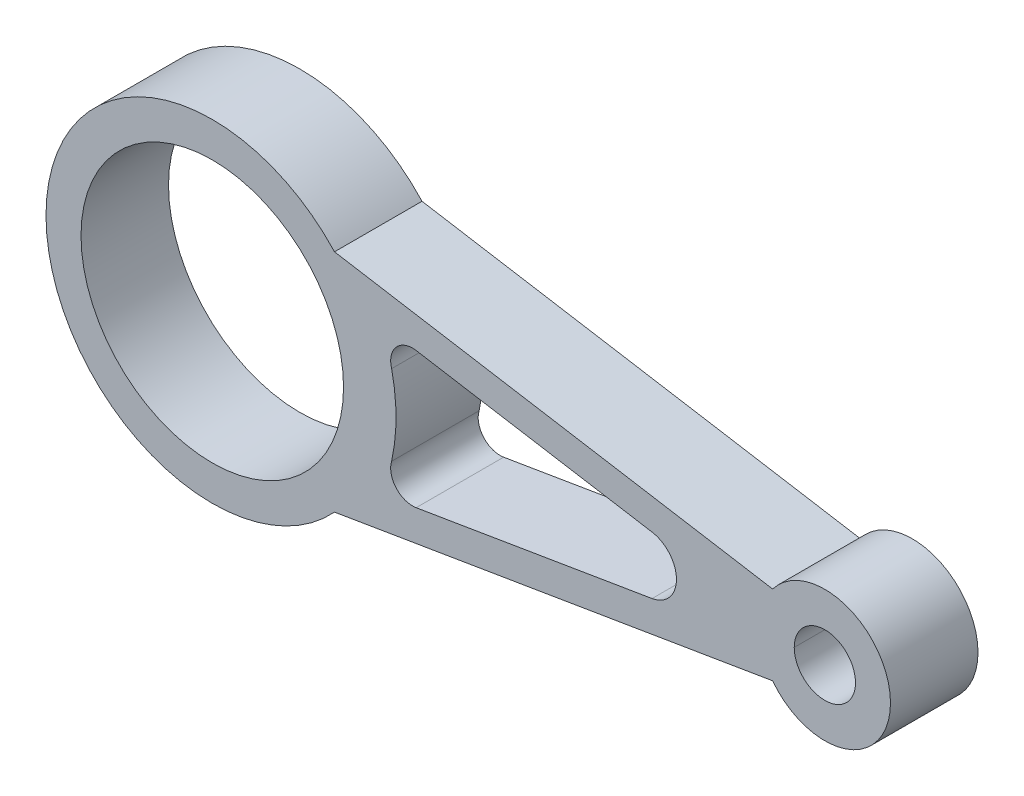
ISO-10303-21;
HEADER;
FILE_DESCRIPTION(('STEP AP214'),'2;1');
FILE_NAME('part.step','',(''),(''),'','','');
FILE_SCHEMA(('AUTOMOTIVE_DESIGN { 1 0 10303 214 1 1 1 1 }'));
ENDSEC;
DATA;
#1=APPLICATION_CONTEXT('core data for automotive mechanical design processes');
#2=APPLICATION_PROTOCOL_DEFINITION('international standard','automotive_design',2000,#1);
#3=PRODUCT_CONTEXT('',#1,'mechanical');
#4=PRODUCT('Part','Part','',(#3));
#5=PRODUCT_RELATED_PRODUCT_CATEGORY('part','',(#4));
#6=PRODUCT_DEFINITION_FORMATION('','',#4);
#7=PRODUCT_DEFINITION_CONTEXT('part definition',#1,'design');
#8=PRODUCT_DEFINITION('design','',#6,#7);
#9=PRODUCT_DEFINITION_SHAPE('','',#8);
#10=(LENGTH_UNIT() NAMED_UNIT(*) SI_UNIT(.MILLI.,.METRE.));
#11=(NAMED_UNIT(*) PLANE_ANGLE_UNIT() SI_UNIT($,.RADIAN.));
#12=(NAMED_UNIT(*) SI_UNIT($,.STERADIAN.) SOLID_ANGLE_UNIT());
#13=UNCERTAINTY_MEASURE_WITH_UNIT(LENGTH_MEASURE(1.E-05),#10,'distance_accuracy_value','');
#14=(GEOMETRIC_REPRESENTATION_CONTEXT(3) GLOBAL_UNCERTAINTY_ASSIGNED_CONTEXT((#13)) GLOBAL_UNIT_ASSIGNED_CONTEXT((#10,
#11,#12)) REPRESENTATION_CONTEXT('',''));
#15=CARTESIAN_POINT('',(0.,0.,0.));
#16=DIRECTION('',(0.,0.,1.));
#17=DIRECTION('',(1.,0.,0.));
#18=AXIS2_PLACEMENT_3D('',#15,#16,#17);
#19=CARTESIAN_POINT('',(140.,0.,10.));
#20=DIRECTION('',(0.,0.,-1.));
#21=DIRECTION('',(-1.,0.,0.));
#22=AXIS2_PLACEMENT_3D('',#19,#20,#21);
#23=CYLINDRICAL_SURFACE('',#22,7.00000000000001);
#24=CARTESIAN_POINT('',(140.,0.,10.));
#25=DIRECTION('',(0.,0.,1.));
#26=DIRECTION('',(1.,0.,0.));
#27=AXIS2_PLACEMENT_3D('',#24,#25,#26);
#28=CIRCLE('',#27,7.00000000000001);
#29=CARTESIAN_POINT('',(133.,0.,10.));
#30=VERTEX_POINT('',#29);
#31=CARTESIAN_POINT('',(147.,0.,10.));
#32=VERTEX_POINT('',#31);
#33=EDGE_CURVE('E186',#30,#32,#28,.T.);
#34=ORIENTED_EDGE('',*,*,#33,.T.);
#35=DIRECTION('',(0.,0.,-1.));
#36=VECTOR('',#35,1.);
#37=CARTESIAN_POINT('',(147.,0.,10.));
#38=LINE('',#37,#36);
#39=CARTESIAN_POINT('',(147.,0.,-10.));
#40=VERTEX_POINT('',#39);
#41=EDGE_CURVE('E11',#32,#40,#38,.T.);
#42=ORIENTED_EDGE('',*,*,#41,.T.);
#43=CARTESIAN_POINT('',(140.,0.,-10.));
#44=DIRECTION('',(0.,0.,1.));
#45=DIRECTION('',(1.,0.,0.));
#46=AXIS2_PLACEMENT_3D('',#43,#44,#45);
#47=CIRCLE('',#46,7.00000000000001);
#48=CARTESIAN_POINT('',(133.,0.,-10.));
#49=VERTEX_POINT('',#48);
#50=EDGE_CURVE('E190',#49,#40,#47,.T.);
#51=ORIENTED_EDGE('',*,*,#50,.F.);
#52=DIRECTION('',(0.,0.,1.));
#53=VECTOR('',#52,1.);
#54=CARTESIAN_POINT('',(133.,0.,10.));
#55=LINE('',#54,#53);
#56=EDGE_CURVE('E49',#49,#30,#55,.T.);
#57=ORIENTED_EDGE('',*,*,#56,.T.);
#58=EDGE_LOOP('',(#34,#42,#51,#57));
#59=FACE_BOUND('',#58,.T.);
#60=ADVANCED_FACE('F40',(#59),#23,.F.);
#61=CARTESIAN_POINT('',(0.,0.,10.));
#62=DIRECTION('',(0.,0.,1.));
#63=DIRECTION('',(1.,0.,0.));
#64=AXIS2_PLACEMENT_3D('',#61,#62,#63);
#65=PLANE('',#64);
#66=ORIENTED_EDGE('',*,*,#33,.F.);
#67=EDGE_CURVE('E189',#32,#30,#28,.T.);
#68=ORIENTED_EDGE('',*,*,#67,.F.);
#69=EDGE_LOOP('',(#66,#68));
#70=FACE_BOUND('',#69,.T.);
#71=CARTESIAN_POINT('',(0.,0.,10.));
#72=DIRECTION('',(0.,0.,1.));
#73=DIRECTION('',(1.,0.,0.));
#74=AXIS2_PLACEMENT_3D('',#71,#72,#73);
#75=CIRCLE('',#74,38.);
#76=CARTESIAN_POINT('',(27.9354736759495,25.7606154914888,10.));
#77=VERTEX_POINT('',#76);
#78=CARTESIAN_POINT('',(27.9354736759495,-25.7606154914888,10.));
#79=VERTEX_POINT('',#78);
#80=EDGE_CURVE('E199',#77,#79,#75,.T.);
#81=ORIENTED_EDGE('',*,*,#80,.T.);
#82=DIRECTION('',(0.986412795984335,0.164285714285714,0.));
#83=VECTOR('',#82,1.);
#84=CARTESIAN_POINT('',(27.9354736759495,-25.7606154914888,10.));
#85=LINE('',#84,#83);
#86=CARTESIAN_POINT('',(128.063755469258,-9.08438586269532,10.));
#87=VERTEX_POINT('',#86);
#88=EDGE_CURVE('E202',#79,#87,#85,.T.);
#89=ORIENTED_EDGE('',*,*,#88,.T.);
#90=CARTESIAN_POINT('',(140.,0.,10.));
#91=DIRECTION('',(0.,0.,1.));
#92=DIRECTION('',(1.,0.,0.));
#93=AXIS2_PLACEMENT_3D('',#90,#91,#92);
#94=CIRCLE('',#93,15.);
#95=CARTESIAN_POINT('',(128.063755469258,9.08438586269531,10.));
#96=VERTEX_POINT('',#95);
#97=EDGE_CURVE('E205',#87,#96,#94,.T.);
#98=ORIENTED_EDGE('',*,*,#97,.T.);
#99=DIRECTION('',(-0.986412795984335,0.164285714285714,0.));
#100=VECTOR('',#99,1.);
#101=CARTESIAN_POINT('',(27.9354736759495,25.7606154914888,10.));
#102=LINE('',#101,#100);
#103=EDGE_CURVE('E207',#96,#77,#102,.T.);
#104=ORIENTED_EDGE('',*,*,#103,.T.);
#105=EDGE_LOOP('',(#81,#89,#98,#104));
#106=FACE_BOUND('',#105,.T.);
#107=CARTESIAN_POINT('',(0.,0.,10.));
#108=DIRECTION('',(0.,0.,1.));
#109=DIRECTION('',(1.,0.,0.));
#110=AXIS2_PLACEMENT_3D('',#107,#108,#109);
#111=CIRCLE('',#110,30.);
#112=CARTESIAN_POINT('',(30.,0.,10.));
#113=VERTEX_POINT('',#112);
#114=EDGE_CURVE('E193',#113,#113,#111,.T.);
#115=ORIENTED_EDGE('',*,*,#114,.F.);
#116=EDGE_LOOP('',(#115));
#117=FACE_BOUND('',#116,.T.);
#118=CARTESIAN_POINT('',(45.7699958112193,10.6250076924855,10.));
#119=DIRECTION('',(0.,0.,1.));
#120=DIRECTION('',(1.,0.,0.));
#121=AXIS2_PLACEMENT_3D('',#118,#119,#120);
#122=CIRCLE('',#121,5.);
#123=CARTESIAN_POINT('',(46.5914243826478,15.5570716724072,10.));
#124=VERTEX_POINT('',#123);
#125=CARTESIAN_POINT('',(40.987646034687,9.16585361737845,10.));
#126=VERTEX_POINT('',#125);
#127=EDGE_CURVE('E134',#124,#126,#122,.T.);
#128=ORIENTED_EDGE('',*,*,#127,.F.);
#129=DIRECTION('',(-0.986412795984335,0.164285714285715,0.));
#130=VECTOR('',#129,1.);
#131=CARTESIAN_POINT('',(46.5914243826478,15.5570716724072,10.));
#132=LINE('',#131,#130);
#133=CARTESIAN_POINT('',(100.514303987717,6.57628915587328,10.));
#134=VERTEX_POINT('',#133);
#135=EDGE_CURVE('E152',#134,#124,#132,.T.);
#136=ORIENTED_EDGE('',*,*,#135,.F.);
#137=CARTESIAN_POINT('',(99.4190319416527,0.,10.));
#138=DIRECTION('',(0.,0.,1.));
#139=DIRECTION('',(-1.,0.,0.));
#140=AXIS2_PLACEMENT_3D('',#137,#138,#139);
#141=CIRCLE('',#140,6.66687332387132);
#142=CARTESIAN_POINT('',(100.514303987717,-6.57628915587328,10.));
#143=VERTEX_POINT('',#142);
#144=EDGE_CURVE('E155',#143,#134,#141,.T.);
#145=ORIENTED_EDGE('',*,*,#144,.F.);
#146=DIRECTION('',(0.986412795984335,0.164285714285715,0.));
#147=VECTOR('',#146,1.);
#148=CARTESIAN_POINT('',(46.5914243826478,-15.5570716724072,10.));
#149=LINE('',#148,#147);
#150=CARTESIAN_POINT('',(46.5914243826478,-15.5570716724072,10.));
#151=VERTEX_POINT('',#150);
#152=EDGE_CURVE('E171',#151,#143,#149,.T.);
#153=ORIENTED_EDGE('',*,*,#152,.F.);
#154=CARTESIAN_POINT('',(45.7699958112193,-10.6250076924855,10.));
#155=DIRECTION('',(0.,0.,1.));
#156=DIRECTION('',(-1.,0.,0.));
#157=AXIS2_PLACEMENT_3D('',#154,#155,#156);
#158=CIRCLE('',#157,5.);
#159=CARTESIAN_POINT('',(40.987646034687,-9.16585361737846,10.));
#160=VERTEX_POINT('',#159);
#161=EDGE_CURVE('E168',#160,#151,#158,.T.);
#162=ORIENTED_EDGE('',*,*,#161,.F.);
#163=CARTESIAN_POINT('',(0.,0.,10.));
#164=DIRECTION('',(0.,0.,-1.));
#165=DIRECTION('',(1.,0.,0.));
#166=AXIS2_PLACEMENT_3D('',#163,#164,#165);
#167=CIRCLE('',#166,42.);
#168=EDGE_CURVE('E166',#126,#160,#167,.T.);
#169=ORIENTED_EDGE('',*,*,#168,.F.);
#170=EDGE_LOOP('',(#128,#136,#145,#153,#162,#169));
#171=FACE_BOUND('',#170,.T.);
#172=ADVANCED_FACE('F234',(#70,#106,#117,#171),#65,.T.);
#173=CARTESIAN_POINT('',(0.,0.,-10.));
#174=DIRECTION('',(0.,0.,1.));
#175=DIRECTION('',(1.,0.,0.));
#176=AXIS2_PLACEMENT_3D('',#173,#174,#175);
#177=PLANE('',#176);
#178=CARTESIAN_POINT('',(0.,0.,-10.));
#179=DIRECTION('',(0.,0.,1.));
#180=DIRECTION('',(1.,0.,0.));
#181=AXIS2_PLACEMENT_3D('',#178,#179,#180);
#182=CIRCLE('',#181,38.);
#183=CARTESIAN_POINT('',(27.9354736759495,25.7606154914888,-10.));
#184=VERTEX_POINT('',#183);
#185=CARTESIAN_POINT('',(27.9354736759495,-25.7606154914888,-10.));
#186=VERTEX_POINT('',#185);
#187=EDGE_CURVE('E196',#184,#186,#182,.T.);
#188=ORIENTED_EDGE('',*,*,#187,.F.);
#189=DIRECTION('',(-0.986412795984335,0.164285714285714,0.));
#190=VECTOR('',#189,1.);
#191=CARTESIAN_POINT('',(27.9354736759495,25.7606154914888,-10.));
#192=LINE('',#191,#190);
#193=CARTESIAN_POINT('',(128.063755469258,9.08438586269531,-10.));
#194=VERTEX_POINT('',#193);
#195=EDGE_CURVE('E203',#194,#184,#192,.T.);
#196=ORIENTED_EDGE('',*,*,#195,.F.);
#197=CARTESIAN_POINT('',(140.,0.,-10.));
#198=DIRECTION('',(0.,0.,1.));
#199=DIRECTION('',(1.,0.,0.));
#200=AXIS2_PLACEMENT_3D('',#197,#198,#199);
#201=CIRCLE('',#200,15.);
#202=CARTESIAN_POINT('',(128.063755469258,-9.08438586269532,-10.));
#203=VERTEX_POINT('',#202);
#204=EDGE_CURVE('E214',#203,#194,#201,.T.);
#205=ORIENTED_EDGE('',*,*,#204,.F.);
#206=DIRECTION('',(0.986412795984335,0.164285714285714,0.));
#207=VECTOR('',#206,1.);
#208=CARTESIAN_POINT('',(27.9354736759495,-25.7606154914888,-10.));
#209=LINE('',#208,#207);
#210=EDGE_CURVE('E212',#186,#203,#209,.T.);
#211=ORIENTED_EDGE('',*,*,#210,.F.);
#212=EDGE_LOOP('',(#188,#196,#205,#211));
#213=FACE_BOUND('',#212,.T.);
#214=CARTESIAN_POINT('',(0.,0.,-10.));
#215=DIRECTION('',(0.,0.,1.));
#216=DIRECTION('',(1.,0.,0.));
#217=AXIS2_PLACEMENT_3D('',#214,#215,#216);
#218=CIRCLE('',#217,30.);
#219=CARTESIAN_POINT('',(30.,0.,-10.));
#220=VERTEX_POINT('',#219);
#221=EDGE_CURVE('E188',#220,#220,#218,.T.);
#222=ORIENTED_EDGE('',*,*,#221,.T.);
#223=EDGE_LOOP('',(#222));
#224=FACE_BOUND('',#223,.T.);
#225=ORIENTED_EDGE('',*,*,#50,.T.);
#226=EDGE_CURVE('E178',#40,#49,#47,.T.);
#227=ORIENTED_EDGE('',*,*,#226,.T.);
#228=EDGE_LOOP('',(#225,#227));
#229=FACE_BOUND('',#228,.T.);
#230=DIRECTION('',(-0.986412795984335,0.164285714285715,0.));
#231=VECTOR('',#230,1.);
#232=CARTESIAN_POINT('',(46.5914243826478,15.5570716724072,-10.));
#233=LINE('',#232,#231);
#234=CARTESIAN_POINT('',(100.514303987717,6.57628915587328,-10.));
#235=VERTEX_POINT('',#234);
#236=CARTESIAN_POINT('',(46.5914243826478,15.5570716724072,-10.));
#237=VERTEX_POINT('',#236);
#238=EDGE_CURVE('E139',#235,#237,#233,.T.);
#239=ORIENTED_EDGE('',*,*,#238,.T.);
#240=CARTESIAN_POINT('',(45.7699958112193,10.6250076924855,-10.));
#241=DIRECTION('',(0.,0.,1.));
#242=DIRECTION('',(1.,0.,0.));
#243=AXIS2_PLACEMENT_3D('',#240,#241,#242);
#244=CIRCLE('',#243,5.);
#245=CARTESIAN_POINT('',(40.987646034687,9.16585361737845,-10.));
#246=VERTEX_POINT('',#245);
#247=EDGE_CURVE('E131',#237,#246,#244,.T.);
#248=ORIENTED_EDGE('',*,*,#247,.T.);
#249=CARTESIAN_POINT('',(0.,0.,-10.));
#250=DIRECTION('',(0.,0.,-1.));
#251=DIRECTION('',(1.,0.,0.));
#252=AXIS2_PLACEMENT_3D('',#249,#250,#251);
#253=CIRCLE('',#252,42.);
#254=CARTESIAN_POINT('',(40.987646034687,-9.16585361737846,-10.));
#255=VERTEX_POINT('',#254);
#256=EDGE_CURVE('E143',#246,#255,#253,.T.);
#257=ORIENTED_EDGE('',*,*,#256,.T.);
#258=CARTESIAN_POINT('',(45.7699958112193,-10.6250076924855,-10.));
#259=DIRECTION('',(0.,0.,1.));
#260=DIRECTION('',(-1.,0.,0.));
#261=AXIS2_PLACEMENT_3D('',#258,#259,#260);
#262=CIRCLE('',#261,5.);
#263=CARTESIAN_POINT('',(46.5914243826478,-15.5570716724072,-10.));
#264=VERTEX_POINT('',#263);
#265=EDGE_CURVE('E147',#255,#264,#262,.T.);
#266=ORIENTED_EDGE('',*,*,#265,.T.);
#267=DIRECTION('',(0.986412795984335,0.164285714285715,0.));
#268=VECTOR('',#267,1.);
#269=CARTESIAN_POINT('',(46.5914243826478,-15.5570716724072,-10.));
#270=LINE('',#269,#268);
#271=CARTESIAN_POINT('',(100.514303987717,-6.57628915587328,-10.));
#272=VERTEX_POINT('',#271);
#273=EDGE_CURVE('E159',#264,#272,#270,.T.);
#274=ORIENTED_EDGE('',*,*,#273,.T.);
#275=CARTESIAN_POINT('',(99.4190319416527,0.,-10.));
#276=DIRECTION('',(0.,0.,1.));
#277=DIRECTION('',(-1.,0.,0.));
#278=AXIS2_PLACEMENT_3D('',#275,#276,#277);
#279=CIRCLE('',#278,6.66687332387132);
#280=EDGE_CURVE('E162',#272,#235,#279,.T.);
#281=ORIENTED_EDGE('',*,*,#280,.T.);
#282=EDGE_LOOP('',(#239,#248,#257,#266,#274,#281));
#283=FACE_BOUND('',#282,.T.);
#284=ADVANCED_FACE('F149',(#213,#224,#229,#283),#177,.F.);
#285=CARTESIAN_POINT('',(0.,0.,10.));
#286=DIRECTION('',(0.,0.,-1.));
#287=DIRECTION('',(-1.,0.,0.));
#288=AXIS2_PLACEMENT_3D('',#285,#286,#287);
#289=CYLINDRICAL_SURFACE('',#288,38.);
#290=ORIENTED_EDGE('',*,*,#187,.T.);
#291=DIRECTION('',(0.,0.,-1.));
#292=VECTOR('',#291,1.);
#293=CARTESIAN_POINT('',(27.9354736759495,-25.7606154914888,10.));
#294=LINE('',#293,#292);
#295=EDGE_CURVE('E225',#79,#186,#294,.T.);
#296=ORIENTED_EDGE('',*,*,#295,.F.);
#297=ORIENTED_EDGE('',*,*,#80,.F.);
#298=DIRECTION('',(0.,0.,-1.));
#299=VECTOR('',#298,1.);
#300=CARTESIAN_POINT('',(27.9354736759495,25.7606154914888,10.));
#301=LINE('',#300,#299);
#302=EDGE_CURVE('E209',#77,#184,#301,.T.);
#303=ORIENTED_EDGE('',*,*,#302,.T.);
#304=EDGE_LOOP('',(#290,#296,#297,#303));
#305=FACE_BOUND('',#304,.T.);
#306=ADVANCED_FACE('F42',(#305),#289,.T.);
#307=CARTESIAN_POINT('',(27.9354736759495,-25.7606154914888,10.));
#308=DIRECTION('',(-0.164285714285714,0.986412795984335,0.));
#309=DIRECTION('',(-0.986412795984335,-0.164285714285714,0.));
#310=AXIS2_PLACEMENT_3D('',#307,#308,#309);
#311=PLANE('',#310);
#312=ORIENTED_EDGE('',*,*,#210,.T.);
#313=DIRECTION('',(0.,0.,-1.));
#314=VECTOR('',#313,1.);
#315=CARTESIAN_POINT('',(128.063755469258,-9.08438586269532,10.));
#316=LINE('',#315,#314);
#317=EDGE_CURVE('E222',#87,#203,#316,.T.);
#318=ORIENTED_EDGE('',*,*,#317,.F.);
#319=ORIENTED_EDGE('',*,*,#88,.F.);
#320=ORIENTED_EDGE('',*,*,#295,.T.);
#321=EDGE_LOOP('',(#312,#318,#319,#320));
#322=FACE_BOUND('',#321,.T.);
#323=ADVANCED_FACE('F265',(#322),#311,.F.);
#324=CARTESIAN_POINT('',(140.,0.,10.));
#325=DIRECTION('',(0.,0.,-1.));
#326=DIRECTION('',(-1.,0.,0.));
#327=AXIS2_PLACEMENT_3D('',#324,#325,#326);
#328=CYLINDRICAL_SURFACE('',#327,15.);
#329=ORIENTED_EDGE('',*,*,#204,.T.);
#330=DIRECTION('',(0.,0.,-1.));
#331=VECTOR('',#330,1.);
#332=CARTESIAN_POINT('',(128.063755469258,9.08438586269531,10.));
#333=LINE('',#332,#331);
#334=EDGE_CURVE('E219',#96,#194,#333,.T.);
#335=ORIENTED_EDGE('',*,*,#334,.F.);
#336=ORIENTED_EDGE('',*,*,#97,.F.);
#337=ORIENTED_EDGE('',*,*,#317,.T.);
#338=EDGE_LOOP('',(#329,#335,#336,#337));
#339=FACE_BOUND('',#338,.T.);
#340=ADVANCED_FACE('F262',(#339),#328,.T.);
#341=CARTESIAN_POINT('',(27.9354736759495,25.7606154914888,10.));
#342=DIRECTION('',(-0.164285714285714,-0.986412795984335,0.));
#343=DIRECTION('',(0.986412795984335,-0.164285714285714,0.));
#344=AXIS2_PLACEMENT_3D('',#341,#342,#343);
#345=PLANE('',#344);
#346=ORIENTED_EDGE('',*,*,#195,.T.);
#347=ORIENTED_EDGE('',*,*,#302,.F.);
#348=ORIENTED_EDGE('',*,*,#103,.F.);
#349=ORIENTED_EDGE('',*,*,#334,.T.);
#350=EDGE_LOOP('',(#346,#347,#348,#349));
#351=FACE_BOUND('',#350,.T.);
#352=ADVANCED_FACE('F246',(#351),#345,.F.);
#353=CARTESIAN_POINT('',(0.,0.,10.));
#354=DIRECTION('',(0.,0.,-1.));
#355=DIRECTION('',(-1.,0.,0.));
#356=AXIS2_PLACEMENT_3D('',#353,#354,#355);
#357=CYLINDRICAL_SURFACE('',#356,30.);
#358=ORIENTED_EDGE('',*,*,#114,.T.);
#359=EDGE_LOOP('',(#358));
#360=FACE_BOUND('',#359,.T.);
#361=ORIENTED_EDGE('',*,*,#221,.F.);
#362=EDGE_LOOP('',(#361));
#363=FACE_BOUND('',#362,.T.);
#364=ADVANCED_FACE('F238',(#360,#363),#357,.F.);
#365=ORIENTED_EDGE('',*,*,#41,.F.);
#366=ORIENTED_EDGE('',*,*,#67,.T.);
#367=ORIENTED_EDGE('',*,*,#56,.F.);
#368=ORIENTED_EDGE('',*,*,#226,.F.);
#369=EDGE_LOOP('',(#365,#366,#367,#368));
#370=FACE_BOUND('',#369,.T.);
#371=ADVANCED_FACE('F236',(#370),#23,.F.);
#372=CARTESIAN_POINT('',(45.7699958112193,10.6250076924855,-10.));
#373=DIRECTION('',(0.,0.,1.));
#374=DIRECTION('',(1.,0.,0.));
#375=AXIS2_PLACEMENT_3D('',#372,#373,#374);
#376=CYLINDRICAL_SURFACE('',#375,5.);
#377=ORIENTED_EDGE('',*,*,#127,.T.);
#378=DIRECTION('',(0.,0.,1.));
#379=VECTOR('',#378,1.);
#380=CARTESIAN_POINT('',(40.987646034687,9.16585361737845,-10.));
#381=LINE('',#380,#379);
#382=EDGE_CURVE('E127',#246,#126,#381,.T.);
#383=ORIENTED_EDGE('',*,*,#382,.F.);
#384=ORIENTED_EDGE('',*,*,#247,.F.);
#385=DIRECTION('',(0.,0.,1.));
#386=VECTOR('',#385,1.);
#387=CARTESIAN_POINT('',(46.5914243826478,15.5570716724072,-10.));
#388=LINE('',#387,#386);
#389=EDGE_CURVE('E176',#237,#124,#388,.T.);
#390=ORIENTED_EDGE('',*,*,#389,.T.);
#391=EDGE_LOOP('',(#377,#383,#384,#390));
#392=FACE_BOUND('',#391,.T.);
#393=ADVANCED_FACE('F129',(#392),#376,.F.);
#394=CARTESIAN_POINT('',(46.5914243826478,15.5570716724072,-10.));
#395=DIRECTION('',(0.164285714285714,0.986412795984335,0.));
#396=DIRECTION('',(-0.986412795984335,0.164285714285715,0.));
#397=AXIS2_PLACEMENT_3D('',#394,#395,#396);
#398=PLANE('',#397);
#399=ORIENTED_EDGE('',*,*,#135,.T.);
#400=ORIENTED_EDGE('',*,*,#389,.F.);
#401=ORIENTED_EDGE('',*,*,#238,.F.);
#402=DIRECTION('',(0.,0.,1.));
#403=VECTOR('',#402,1.);
#404=CARTESIAN_POINT('',(100.514303987717,6.57628915587328,-10.));
#405=LINE('',#404,#403);
#406=EDGE_CURVE('E179',#235,#134,#405,.T.);
#407=ORIENTED_EDGE('',*,*,#406,.T.);
#408=EDGE_LOOP('',(#399,#400,#401,#407));
#409=FACE_BOUND('',#408,.T.);
#410=ADVANCED_FACE('F244',(#409),#398,.F.);
#411=CARTESIAN_POINT('',(99.4190319416527,0.,-10.));
#412=DIRECTION('',(0.,0.,1.));
#413=DIRECTION('',(1.,0.,0.));
#414=AXIS2_PLACEMENT_3D('',#411,#412,#413);
#415=CYLINDRICAL_SURFACE('',#414,6.66687332387132);
#416=ORIENTED_EDGE('',*,*,#144,.T.);
#417=ORIENTED_EDGE('',*,*,#406,.F.);
#418=ORIENTED_EDGE('',*,*,#280,.F.);
#419=DIRECTION('',(0.,0.,1.));
#420=VECTOR('',#419,1.);
#421=CARTESIAN_POINT('',(100.514303987717,-6.57628915587328,-10.));
#422=LINE('',#421,#420);
#423=EDGE_CURVE('E181',#272,#143,#422,.T.);
#424=ORIENTED_EDGE('',*,*,#423,.T.);
#425=EDGE_LOOP('',(#416,#417,#418,#424));
#426=FACE_BOUND('',#425,.T.);
#427=ADVANCED_FACE('F298',(#426),#415,.F.);
#428=CARTESIAN_POINT('',(46.5914243826478,-15.5570716724072,-10.));
#429=DIRECTION('',(0.164285714285714,-0.986412795984335,0.));
#430=DIRECTION('',(0.986412795984335,0.164285714285715,0.));
#431=AXIS2_PLACEMENT_3D('',#428,#429,#430);
#432=PLANE('',#431);
#433=ORIENTED_EDGE('',*,*,#152,.T.);
#434=ORIENTED_EDGE('',*,*,#423,.F.);
#435=ORIENTED_EDGE('',*,*,#273,.F.);
#436=DIRECTION('',(0.,0.,1.));
#437=VECTOR('',#436,1.);
#438=CARTESIAN_POINT('',(46.5914243826478,-15.5570716724072,-10.));
#439=LINE('',#438,#437);
#440=EDGE_CURVE('E183',#264,#151,#439,.T.);
#441=ORIENTED_EDGE('',*,*,#440,.T.);
#442=EDGE_LOOP('',(#433,#434,#435,#441));
#443=FACE_BOUND('',#442,.T.);
#444=ADVANCED_FACE('F296',(#443),#432,.F.);
#445=CARTESIAN_POINT('',(45.7699958112193,-10.6250076924855,-10.));
#446=DIRECTION('',(0.,0.,1.));
#447=DIRECTION('',(1.,0.,0.));
#448=AXIS2_PLACEMENT_3D('',#445,#446,#447);
#449=CYLINDRICAL_SURFACE('',#448,5.);
#450=ORIENTED_EDGE('',*,*,#161,.T.);
#451=ORIENTED_EDGE('',*,*,#440,.F.);
#452=ORIENTED_EDGE('',*,*,#265,.F.);
#453=DIRECTION('',(0.,0.,1.));
#454=VECTOR('',#453,1.);
#455=CARTESIAN_POINT('',(40.987646034687,-9.16585361737846,-10.));
#456=LINE('',#455,#454);
#457=EDGE_CURVE('E138',#255,#160,#456,.T.);
#458=ORIENTED_EDGE('',*,*,#457,.T.);
#459=EDGE_LOOP('',(#450,#451,#452,#458));
#460=FACE_BOUND('',#459,.T.);
#461=ADVANCED_FACE('F292',(#460),#449,.F.);
#462=CARTESIAN_POINT('',(0.,0.,-10.));
#463=DIRECTION('',(0.,0.,1.));
#464=DIRECTION('',(1.,0.,0.));
#465=AXIS2_PLACEMENT_3D('',#462,#463,#464);
#466=CYLINDRICAL_SURFACE('',#465,42.);
#467=ORIENTED_EDGE('',*,*,#168,.T.);
#468=ORIENTED_EDGE('',*,*,#457,.F.);
#469=ORIENTED_EDGE('',*,*,#256,.F.);
#470=ORIENTED_EDGE('',*,*,#382,.T.);
#471=EDGE_LOOP('',(#467,#468,#469,#470));
#472=FACE_BOUND('',#471,.T.);
#473=ADVANCED_FACE('F144',(#472),#466,.T.);
#474=CLOSED_SHELL('',(#60,#172,#284,#306,#323,#340,#352,#364,#371,#393,#410,#427,#444,#461,#473));
#475=MANIFOLD_SOLID_BREP('B2',#474);
#476=ADVANCED_BREP_SHAPE_REPRESENTATION('',(#18,#475),#14);
#477=SHAPE_DEFINITION_REPRESENTATION(#9,#476);
ENDSEC;
END-ISO-10303-21;
